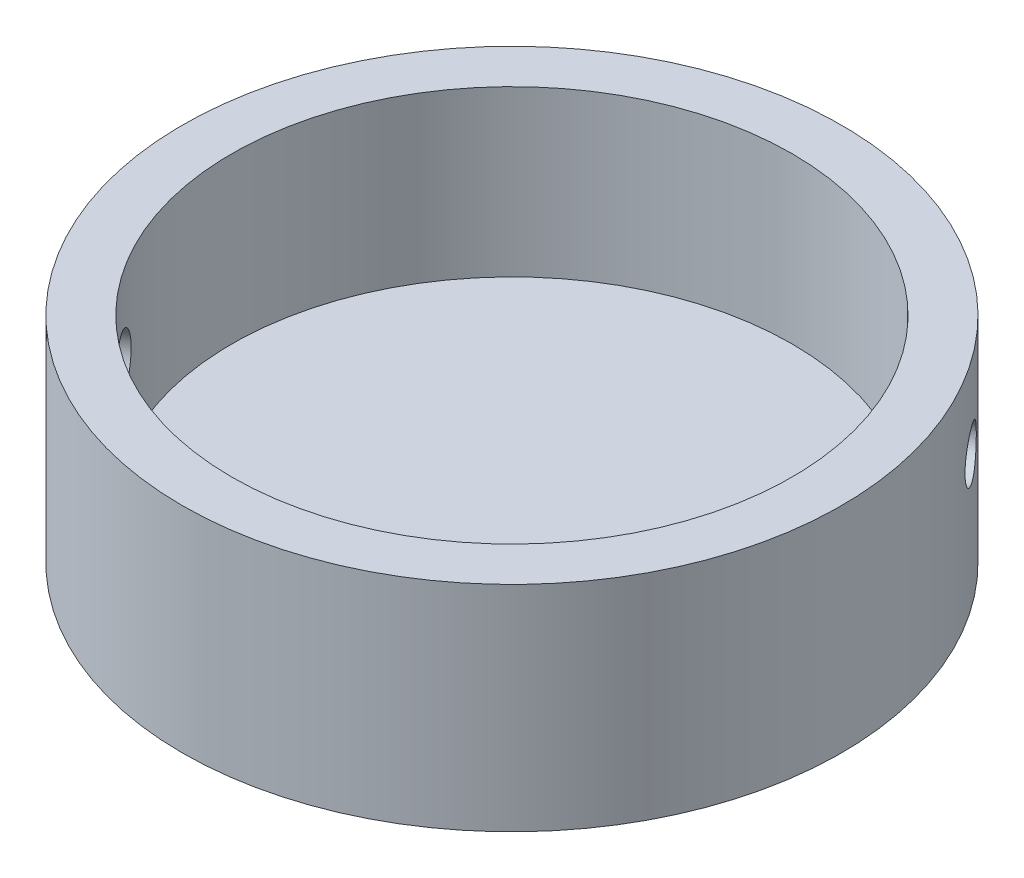
ISO-10303-21;
HEADER;
FILE_DESCRIPTION(('STEP AP214'),'2;1');
FILE_NAME('part.step','',(''),(''),'','','');
FILE_SCHEMA(('AUTOMOTIVE_DESIGN { 1 0 10303 214 1 1 1 1 }'));
ENDSEC;
DATA;
#1=APPLICATION_CONTEXT('core data for automotive mechanical design processes');
#2=APPLICATION_PROTOCOL_DEFINITION('international standard','automotive_design',2000,#1);
#3=PRODUCT_CONTEXT('',#1,'mechanical');
#4=PRODUCT('Part','Part','',(#3));
#5=PRODUCT_RELATED_PRODUCT_CATEGORY('part','',(#4));
#6=PRODUCT_DEFINITION_FORMATION('','',#4);
#7=PRODUCT_DEFINITION_CONTEXT('part definition',#1,'design');
#8=PRODUCT_DEFINITION('design','',#6,#7);
#9=PRODUCT_DEFINITION_SHAPE('','',#8);
#10=(LENGTH_UNIT() NAMED_UNIT(*) SI_UNIT(.MILLI.,.METRE.));
#11=(NAMED_UNIT(*) PLANE_ANGLE_UNIT() SI_UNIT($,.RADIAN.));
#12=(NAMED_UNIT(*) SI_UNIT($,.STERADIAN.) SOLID_ANGLE_UNIT());
#13=UNCERTAINTY_MEASURE_WITH_UNIT(LENGTH_MEASURE(1.E-05),#10,'distance_accuracy_value','');
#14=(GEOMETRIC_REPRESENTATION_CONTEXT(3) GLOBAL_UNCERTAINTY_ASSIGNED_CONTEXT((#13)) GLOBAL_UNIT_ASSIGNED_CONTEXT((#10,
#11,#12)) REPRESENTATION_CONTEXT('',''));
#15=CARTESIAN_POINT('',(0.,0.,0.));
#16=DIRECTION('',(0.,0.,1.));
#17=DIRECTION('',(1.,0.,0.));
#18=AXIS2_PLACEMENT_3D('',#15,#16,#17);
#19=CARTESIAN_POINT('',(0.,7.99999999999999,0.));
#20=DIRECTION('',(0.,-1.,0.));
#21=DIRECTION('',(0.,0.,-1.));
#22=AXIS2_PLACEMENT_3D('',#19,#20,#21);
#23=CYLINDRICAL_SURFACE('',#22,20.);
#24=CARTESIAN_POINT('',(17.0644188835617,7.99999999999999,-10.4309926740623));
#25=CARTESIAN_POINT('',(17.0644173383923,8.08412843427789,-10.4309961047137));
#26=CARTESIAN_POINT('',(17.0607078905008,8.16831485179459,-10.4370711444143));
#27=CARTESIAN_POINT('',(17.0459282208084,8.33436041564788,-10.4611913006159));
#28=CARTESIAN_POINT('',(17.0348495599132,8.41621678144795,-10.4792501407004));
#29=CARTESIAN_POINT('',(17.0055455498797,8.57517318343043,-10.5267371194599));
#30=CARTESIAN_POINT('',(16.9873241310381,8.65227580839915,-10.556159005497));
#31=CARTESIAN_POINT('',(16.9440949376596,8.7995725054576,-10.6254084527644));
#32=CARTESIAN_POINT('',(16.9190886586269,8.86976809534024,-10.6652337208319));
#33=CARTESIAN_POINT('',(16.8627399067336,9.00142502378373,-10.7541047087188));
#34=CARTESIAN_POINT('',(16.8313857143182,9.06286984389574,-10.803167470946));
#35=CARTESIAN_POINT('',(16.7630338766899,9.17513932464771,-10.9089252966577));
#36=CARTESIAN_POINT('',(16.7260359899343,9.22596353051863,-10.9656206867964));
#37=CARTESIAN_POINT('',(16.6471829029336,9.3156025520847,-11.084963448719));
#38=CARTESIAN_POINT('',(16.6053220898975,9.35440329709456,-11.1476176827794));
#39=CARTESIAN_POINT('',(16.5177847399715,9.41880396212044,-11.2769178517348));
#40=CARTESIAN_POINT('',(16.4721082585973,9.44440407415871,-11.3435637285498));
#41=CARTESIAN_POINT('',(16.3782020409041,9.48162983930447,-11.4787304870731));
#42=CARTESIAN_POINT('',(16.3299773150638,9.49328192297795,-11.5472475700493));
#43=CARTESIAN_POINT('',(16.2322093666743,9.50236254222416,-11.6842826960289));
#44=CARTESIAN_POINT('',(16.1826661644673,9.49979129711512,-11.7528007390011));
#45=CARTESIAN_POINT('',(16.0837868089909,9.48051993914591,-11.8877578950623));
#46=CARTESIAN_POINT('',(16.0344504397042,9.46384825115788,-11.9542009119524));
#47=CARTESIAN_POINT('',(15.9373660159192,9.41689341610155,-12.0833312519125));
#48=CARTESIAN_POINT('',(15.8896179740801,9.38661016057539,-12.146018545052));
#49=CARTESIAN_POINT('',(15.797156020124,9.31325991981666,-12.2660349093256));
#50=CARTESIAN_POINT('',(15.7524452003466,9.27018013860902,-12.3233585412199));
#51=CARTESIAN_POINT('',(15.6675583211121,9.17246901940773,-12.4311032528705));
#52=CARTESIAN_POINT('',(15.6273823358892,9.11783749235692,-12.4815242196347));
#53=CARTESIAN_POINT('',(15.5528168456133,8.99841332034257,-12.5743169968289));
#54=CARTESIAN_POINT('',(15.5184418314688,8.93359598808411,-12.6166686831287));
#55=CARTESIAN_POINT('',(15.4567889279755,8.79572636267122,-12.6921258240384));
#56=CARTESIAN_POINT('',(15.429511042994,8.72267406444935,-12.7252312729586));
#57=CARTESIAN_POINT('',(15.3830201472134,8.57039149562516,-12.7813937812065));
#58=CARTESIAN_POINT('',(15.3638078770393,8.49116065847027,-12.8044499177638));
#59=CARTESIAN_POINT('',(15.3341514129743,8.32877791939068,-12.8399509416727));
#60=CARTESIAN_POINT('',(15.3237070701451,8.24562608409614,-12.8523960092716));
#61=CARTESIAN_POINT('',(15.3119863497065,8.07797842309253,-12.866357628433));
#62=CARTESIAN_POINT('',(15.3106877158547,7.99348636190844,-12.8679007101975));
#63=CARTESIAN_POINT('',(15.3172475133819,7.8253662401495,-12.8600915085089));
#64=CARTESIAN_POINT('',(15.3251058757916,7.74173817307193,-12.8507393071179));
#65=CARTESIAN_POINT('',(15.3496752089435,7.57781842664373,-12.8213818637834));
#66=CARTESIAN_POINT('',(15.3663759132715,7.49752299428426,-12.8013889760843));
#67=CARTESIAN_POINT('',(15.4080170561139,7.3424317326262,-12.7512378433794));
#68=CARTESIAN_POINT('',(15.4329576020316,7.26763597502932,-12.72107946587));
#69=CARTESIAN_POINT('',(15.4902468534266,7.1255089474427,-12.6512563781895));
#70=CARTESIAN_POINT('',(15.5226097452444,7.05819234289802,-12.6115734568992));
#71=CARTESIAN_POINT('',(15.5935915420261,6.93308250175659,-12.5237009091231));
#72=CARTESIAN_POINT('',(15.632210534419,6.87528939827337,-12.4755111637538));
#73=CARTESIAN_POINT('',(15.7144824592902,6.77074974789214,-12.371718829589));
#74=CARTESIAN_POINT('',(15.7581453371984,6.72402559930597,-12.316101560477));
#75=CARTESIAN_POINT('',(15.8490056712914,6.64310368490611,-12.1989551420689));
#76=CARTESIAN_POINT('',(15.8962030979644,6.60890581451859,-12.1374260421322));
#77=CARTESIAN_POINT('',(15.9925811267392,6.554045891645,-12.0101502480073));
#78=CARTESIAN_POINT('',(16.0417596228471,6.53336984779076,-11.944407990888));
#79=CARTESIAN_POINT('',(16.1406416176612,6.50609474029986,-11.810445205782));
#80=CARTESIAN_POINT('',(16.1903451084935,6.49949546583584,-11.7422247149273));
#81=CARTESIAN_POINT('',(16.2887029292628,6.50056348721076,-11.6053969755487));
#82=CARTESIAN_POINT('',(16.3373595344109,6.50819581456374,-11.5367910868617));
#83=CARTESIAN_POINT('',(16.4324066404482,6.53743764383149,-11.4010035945233));
#84=CARTESIAN_POINT('',(16.4787971378177,6.55904716745487,-11.3338219930842));
#85=CARTESIAN_POINT('',(16.5681050496779,6.61562148054332,-11.2028648931852));
#86=CARTESIAN_POINT('',(16.61102257752,6.65058583391831,-11.139089283583));
#87=CARTESIAN_POINT('',(16.6923412210212,6.73287303275345,-11.0168570899139));
#88=CARTESIAN_POINT('',(16.7307424278199,6.78019562876177,-10.9584003985165));
#89=CARTESIAN_POINT('',(16.802238167585,6.88598681075831,-10.8484611924865));
#90=CARTESIAN_POINT('',(16.8353201309803,6.94448110311178,-10.796995240477));
#91=CARTESIAN_POINT('',(16.8953632989794,7.07091236452848,-10.7027953481066));
#92=CARTESIAN_POINT('',(16.9223230127681,7.13885162703556,-10.6600635348285));
#93=CARTESIAN_POINT('',(16.9695957056114,7.28235230828201,-10.5846498219784));
#94=CARTESIAN_POINT('',(16.9898980148269,7.35792571120347,-10.5519840602923));
#95=CARTESIAN_POINT('',(17.0233770056242,7.51440922893565,-10.4978882058155));
#96=CARTESIAN_POINT('',(17.0365619466321,7.59531303510229,-10.4764450904689));
#97=CARTESIAN_POINT('',(17.0521728393482,7.73058498515484,-10.4510060985272));
#98=CARTESIAN_POINT('',(17.0567607923755,7.78408113000137,-10.4435121586202));
#99=CARTESIAN_POINT('',(17.062884308621,7.89171017465653,-10.4335043473924));
#100=CARTESIAN_POINT('',(17.0644198782507,7.94584307312744,-10.4309904656112));
#101=CARTESIAN_POINT('',(17.0644188835617,7.99999999999999,-10.4309926740623));
#102=B_SPLINE_CURVE_WITH_KNOTS('',3,(#24,#25,#26,#27,#28,#29,#30,#31,#32,#33,#34,#35,#36,#37,
#38,#39,#40,#41,#42,#43,#44,#45,#46,#47,#48,#49,#50,#51,#52,#53,#54,#55,#56,#57,#58,#59,#60,#61,
#62,#63,#64,#65,#66,#67,#68,#69,#70,#71,#72,#73,#74,#75,#76,#77,#78,#79,#80,#81,#82,#83,#84,#85,
#86,#87,#88,#89,#90,#91,#92,#93,#94,#95,#96,#97,#98,#99,#100,#101),.UNSPECIFIED.,.T.,.F.,(4,2,2,
2,2,2,2,2,2,2,2,2,2,2,2,2,2,2,2,2,2,2,2,2,2,2,2,2,2,2,2,2,2,2,2,2,2,2,4),(0.,0.252187579339041,
0.504664457860794,0.757002605762187,1.00928517896143,1.26203783609002,1.5148013137358,
1.76785948521026,2.02091397548468,2.2734881817416,2.52605849341277,2.77812086259579,
3.03018524026398,3.28250252487075,3.53482393925043,3.7877666140638,4.04070944452772,
4.2936754963882,4.54663725110237,4.79898320559481,5.0513272594613,5.30337896930956,
5.55543396468601,5.80797478825659,6.06051914138528,6.31357024084872,6.5666192277034,
6.81940596249449,7.07218891127965,7.32435156508922,7.57651461054472,7.82866942254426,
8.08081914517806,8.33355621784139,8.58635476809665,8.83955652118654,9.09246380844972,
9.25480764733516,9.41715114522215),.UNSPECIFIED.);
#103=CARTESIAN_POINT('',(17.0644188835617,7.99999999999999,-10.4309926740623));
#104=VERTEX_POINT('',#103);
#105=EDGE_CURVE('E82',#104,#104,#102,.T.);
#106=ORIENTED_EDGE('',*,*,#105,.T.);
#107=EDGE_LOOP('',(#106));
#108=FACE_BOUND('',#107,.T.);
#109=CARTESIAN_POINT('',(-14.9845144139128,7.99999999999999,13.2462948698585));
#110=CARTESIAN_POINT('',(-14.9845183149582,7.88796087165279,13.2462916978549));
#111=CARTESIAN_POINT('',(-14.9908080350085,7.77584766317631,13.2391859125193));
#112=CARTESIAN_POINT('',(-15.0157398420939,7.55472962741292,13.2109007525868));
#113=CARTESIAN_POINT('',(-15.0343955419335,7.44572836392501,13.1897058682559));
#114=CARTESIAN_POINT('',(-15.0833200432092,7.23406836156418,13.1337287089828));
#115=CARTESIAN_POINT('',(-15.1135818041265,7.13140582121711,13.0989546712529));
#116=CARTESIAN_POINT('',(-15.1845554188817,6.93526441541649,13.0166131154718));
#117=CARTESIAN_POINT('',(-15.2252651971653,6.84178373103256,12.969048138319));
#118=CARTESIAN_POINT('',(-15.3157789498041,6.666297472685,12.8620304758411));
#119=CARTESIAN_POINT('',(-15.3656119046822,6.58432998099243,12.8025398488208));
#120=CARTESIAN_POINT('',(-15.4724976808217,6.43452478199286,12.6731543949427));
#121=CARTESIAN_POINT('',(-15.5295508322328,6.36668772118737,12.6032590922965));
#122=CARTESIAN_POINT('',(-15.6490292404276,6.24693748598569,12.4545968541747));
#123=CARTESIAN_POINT('',(-15.7114655116702,6.19505800241266,12.3758116221766));
#124=CARTESIAN_POINT('',(-15.8395204292836,6.10891113370263,12.2114876633666));
#125=CARTESIAN_POINT('',(-15.9051389980395,6.07464331926106,12.1259491012334));
#126=CARTESIAN_POINT('',(-16.0372375072753,6.0248041812935,11.950690684478));
#127=CARTESIAN_POINT('',(-16.1037138063949,6.0091703345001,11.8609858678585));
#128=CARTESIAN_POINT('',(-16.2357375720002,5.99684946173256,11.6796149006993));
#129=CARTESIAN_POINT('',(-16.3012850625245,6.00016194450745,11.5879488010742));
#130=CARTESIAN_POINT('',(-16.429369419746,6.0255889453003,11.4056211107144));
#131=CARTESIAN_POINT('',(-16.4919162079829,6.04763623112777,11.3149571009191));
#132=CARTESIAN_POINT('',(-16.6126291642053,6.10980225789323,11.1369710056473));
#133=CARTESIAN_POINT('',(-16.6707952752762,6.14992123357514,11.0496489635976));
#134=CARTESIAN_POINT('',(-16.7814687320953,6.24716552650887,10.8808328563149));
#135=CARTESIAN_POINT('',(-16.8339659575671,6.30432059506031,10.7993492985881));
#136=CARTESIAN_POINT('',(-16.9320582523819,6.43399304667273,10.644894895585));
#137=CARTESIAN_POINT('',(-16.9776531192264,6.50651088029036,10.5719243000727));
#138=CARTESIAN_POINT('',(-17.0612346973385,6.66522845902729,10.4365053523234));
#139=CARTESIAN_POINT('',(-17.0991872409993,6.75148668948315,10.3741044444437));
#140=CARTESIAN_POINT('',(-17.1665484006465,6.93503373042155,10.2622557227076));
#141=CARTESIAN_POINT('',(-17.1959570042394,7.03232255690428,10.2128079276404));
#142=CARTESIAN_POINT('',(-17.2457399443978,7.23521405039957,10.1285172824708));
#143=CARTESIAN_POINT('',(-17.2661123761087,7.34081846484577,10.0936775118724));
#144=CARTESIAN_POINT('',(-17.2974843975831,7.55732120922937,10.0398213913463));
#145=CARTESIAN_POINT('',(-17.3084842728973,7.66821937777488,10.0208045593464));
#146=CARTESIAN_POINT('',(-17.3209120094468,7.89164835905901,9.99930815506282));
#147=CARTESIAN_POINT('',(-17.3223810480221,8.00417004052966,9.99675744225545));
#148=CARTESIAN_POINT('',(-17.3158339434294,8.22810253164572,10.0080935251849));
#149=CARTESIAN_POINT('',(-17.3078179284252,8.33951335628073,10.0219800988179));
#150=CARTESIAN_POINT('',(-17.2824524770165,8.55782316455668,10.0656577242921));
#151=CARTESIAN_POINT('',(-17.2651227003489,8.66473114218931,10.0954152742466));
#152=CARTESIAN_POINT('',(-17.2214156037585,8.8712801034606,10.1697932323263));
#153=CARTESIAN_POINT('',(-17.1950380765881,8.97092092057436,10.2144139809069));
#154=CARTESIAN_POINT('',(-17.1335623122578,9.16047994805754,10.3172005511324));
#155=CARTESIAN_POINT('',(-17.0984346755864,9.2503638839325,10.3754119939598));
#156=CARTESIAN_POINT('',(-17.0201184413915,9.41751010654812,10.5033890542823));
#157=CARTESIAN_POINT('',(-16.9769296442737,9.49477208068014,10.573154957861));
#158=CARTESIAN_POINT('',(-16.8831402886953,9.63476326679618,10.722282678576));
#159=CARTESIAN_POINT('',(-16.8325135886334,9.69743911917243,10.8016781611508));
#160=CARTESIAN_POINT('',(-16.7250288629876,9.80611173701282,10.9673673992827));
#161=CARTESIAN_POINT('',(-16.6681709227994,9.8521087310142,11.0536610602998));
#162=CARTESIAN_POINT('',(-16.5496500188776,9.92602753531066,11.230332566447));
#163=CARTESIAN_POINT('',(-16.4879958444236,9.95398157465042,11.3207028190358));
#164=CARTESIAN_POINT('',(-16.3613649607151,9.99112613915968,11.502958033132));
#165=CARTESIAN_POINT('',(-16.2963883448914,10.0003171916681,11.594842951996));
#166=CARTESIAN_POINT('',(-16.1651997918085,9.99966746712011,11.7770481968377));
#167=CARTESIAN_POINT('',(-16.0989944787924,9.98990952632668,11.8673735990416));
#168=CARTESIAN_POINT('',(-15.9670227106613,9.95181250868604,12.0443503372663));
#169=CARTESIAN_POINT('',(-15.9012562558909,9.92347341725406,12.1310016704032));
#170=CARTESIAN_POINT('',(-15.7722176816676,9.84904148521413,12.2983054979207));
#171=CARTESIAN_POINT('',(-15.7089452232964,9.80295106613168,12.3789588087246));
#172=CARTESIAN_POINT('',(-15.5869443607007,9.69433366216603,12.5322293434281));
#173=CARTESIAN_POINT('',(-15.5282159298902,9.63180677345775,12.6048466143456));
#174=CARTESIAN_POINT('',(-15.4170568393163,9.49178076195249,12.7405690163148));
#175=CARTESIAN_POINT('',(-15.3646536150393,9.41421996751039,12.8036329916078));
#176=CARTESIAN_POINT('',(-15.2682789190856,9.2464492969091,12.918409002925));
#177=CARTESIAN_POINT('',(-15.2243094738978,9.15623638966184,12.9701183110535));
#178=CARTESIAN_POINT('',(-15.1463369673491,8.96547131616017,13.0610905510832));
#179=CARTESIAN_POINT('',(-15.1123595381581,8.86489343735189,13.1003214933223));
#180=CARTESIAN_POINT('',(-15.0558526377605,8.65650341750753,13.1652257915461));
#181=CARTESIAN_POINT('',(-15.0333102546479,8.54869959214856,13.1909144401318));
#182=CARTESIAN_POINT('',(-15.0061690088013,8.36690451820176,13.2217676624932));
#183=CARTESIAN_POINT('',(-14.9980629617503,8.29407549738714,13.2309551893796));
#184=CARTESIAN_POINT('',(-14.9872343913175,8.14750835391489,13.2432198245127));
#185=CARTESIAN_POINT('',(-14.9845118453367,8.07377023507481,13.2462969584096));
#186=CARTESIAN_POINT('',(-14.9845144139128,7.99999999999999,13.2462948698585));
#187=B_SPLINE_CURVE_WITH_KNOTS('',3,(#109,#110,#111,#112,#113,#114,#115,#116,#117,#118,#119,
#120,#121,#122,#123,#124,#125,#126,#127,#128,#129,#130,#131,#132,#133,#134,#135,#136,#137,#138,
#139,#140,#141,#142,#143,#144,#145,#146,#147,#148,#149,#150,#151,#152,#153,#154,#155,#156,#157,
#158,#159,#160,#161,#162,#163,#164,#165,#166,#167,#168,#169,#170,#171,#172,#173,#174,#175,#176,
#177,#178,#179,#180,#181,#182,#183,#184,#185,#186),.UNSPECIFIED.,.T.,.F.,(4,2,2,2,2,2,2,2,2,2,2,
2,2,2,2,2,2,2,2,2,2,2,2,2,2,2,2,2,2,2,2,2,2,2,2,2,2,2,4),(0.,0.335847988872924,
0.672066303643539,1.00808098199495,1.34402896084263,1.6810632305985,2.01811291710506,
2.35586939942583,2.69361764815589,3.03022941796899,3.36683245996464,3.70223263637323,
4.03763716961948,4.37363090932827,4.70963450437057,5.04710850170002,5.38458298855125,
5.72212858235867,6.05966389190066,6.3957399261553,6.7318114193374,7.06717629409054,
7.40254885122094,7.73906379623435,8.07558707446405,8.41332273636236,8.75105377036009,
9.08817985388722,9.42529646226298,9.76094266936965,10.0965891399332,10.4321898399049,
10.767788576216,11.1047943007598,11.4418809006905,11.7798248214095,12.11738629788,
12.3385205521209,12.5596538780763),.UNSPECIFIED.);
#188=CARTESIAN_POINT('',(-14.9845144139128,7.99999999999999,13.2462948698585));
#189=VERTEX_POINT('',#188);
#190=EDGE_CURVE('E72',#189,#189,#187,.T.);
#191=ORIENTED_EDGE('',*,*,#190,.T.);
#192=EDGE_LOOP('',(#191));
#193=FACE_BOUND('',#192,.T.);
#194=CARTESIAN_POINT('',(0.,0.,0.));
#195=DIRECTION('',(0.,1.,0.));
#196=DIRECTION('',(0.,0.,1.));
#197=AXIS2_PLACEMENT_3D('',#194,#195,#196);
#198=CIRCLE('',#197,20.);
#199=CARTESIAN_POINT('',(0.,0.,20.));
#200=VERTEX_POINT('',#199);
#201=EDGE_CURVE('E11',#200,#200,#198,.T.);
#202=ORIENTED_EDGE('',*,*,#201,.T.);
#203=EDGE_LOOP('',(#202));
#204=FACE_BOUND('',#203,.T.);
#205=CARTESIAN_POINT('',(0.,13.,0.));
#206=DIRECTION('',(0.,1.,0.));
#207=DIRECTION('',(0.,0.,1.));
#208=AXIS2_PLACEMENT_3D('',#205,#206,#207);
#209=CIRCLE('',#208,20.);
#210=CARTESIAN_POINT('',(0.,13.,20.));
#211=VERTEX_POINT('',#210);
#212=EDGE_CURVE('E66',#211,#211,#209,.T.);
#213=ORIENTED_EDGE('',*,*,#212,.F.);
#214=EDGE_LOOP('',(#213));
#215=FACE_BOUND('',#214,.T.);
#216=ADVANCED_FACE('F52',(#108,#193,#204,#215),#23,.T.);
#217=CARTESIAN_POINT('',(0.,0.,0.));
#218=DIRECTION('',(0.,1.,0.));
#219=DIRECTION('',(0.,0.,1.));
#220=AXIS2_PLACEMENT_3D('',#217,#218,#219);
#221=PLANE('',#220);
#222=ORIENTED_EDGE('',*,*,#201,.F.);
#223=EDGE_LOOP('',(#222));
#224=FACE_BOUND('',#223,.T.);
#225=ADVANCED_FACE('F117',(#224),#221,.F.);
#226=CARTESIAN_POINT('',(0.,13.,0.));
#227=DIRECTION('',(0.,1.,0.));
#228=DIRECTION('',(0.,0.,1.));
#229=AXIS2_PLACEMENT_3D('',#226,#227,#228);
#230=PLANE('',#229);
#231=CARTESIAN_POINT('',(0.,13.,0.));
#232=DIRECTION('',(0.,1.,0.));
#233=DIRECTION('',(0.,0.,1.));
#234=AXIS2_PLACEMENT_3D('',#231,#232,#233);
#235=CIRCLE('',#234,17.);
#236=CARTESIAN_POINT('',(0.,13.,17.));
#237=VERTEX_POINT('',#236);
#238=EDGE_CURVE('E102',#237,#237,#235,.T.);
#239=ORIENTED_EDGE('',*,*,#238,.F.);
#240=EDGE_LOOP('',(#239));
#241=FACE_BOUND('',#240,.T.);
#242=ORIENTED_EDGE('',*,*,#212,.T.);
#243=EDGE_LOOP('',(#242));
#244=FACE_BOUND('',#243,.T.);
#245=ADVANCED_FACE('F91',(#241,#244),#230,.T.);
#246=CARTESIAN_POINT('',(0.,7.99999999999999,0.));
#247=DIRECTION('',(-0.811701653998608,0.,0.584072277116389));
#248=DIRECTION('',(0.584072277116389,0.,0.811701653998608));
#249=AXIS2_PLACEMENT_3D('',#246,#247,#248);
#250=CYLINDRICAL_SURFACE('',#249,2.);
#251=CARTESIAN_POINT('',(-12.5349565146736,7.99999999999999,11.4836782075798));
#252=CARTESIAN_POINT('',(-12.5349605484548,7.88807699028084,11.4836752102923));
#253=CARTESIAN_POINT('',(-12.5413756191528,7.77608274141139,11.4766836026574));
#254=CARTESIAN_POINT('',(-12.5667910404063,7.5552073346403,11.4488472982893));
#255=CARTESIAN_POINT('',(-12.5858047697674,7.44632961461086,11.4279878749247));
#256=CARTESIAN_POINT('',(-12.6356271073104,7.23491737893529,11.3728755754074));
#257=CARTESIAN_POINT('',(-12.6664279812787,7.13237875498617,11.3386314813817));
#258=CARTESIAN_POINT('',(-12.7385929491791,6.93646091980448,11.2574945478664));
#259=CARTESIAN_POINT('',(-12.7799551450063,6.84308006688601,11.2106039811445));
#260=CARTESIAN_POINT('',(-12.8718671506637,6.66764392980859,11.104951420437));
#261=CARTESIAN_POINT('',(-12.9224569212874,6.58564074887654,11.0461376635339));
#262=CARTESIAN_POINT('',(-13.0308306268422,6.43573737563442,10.9180801794167));
#263=CARTESIAN_POINT('',(-13.0886149101538,6.367837866693,10.8488359470925));
#264=CARTESIAN_POINT('',(-13.2095035059974,6.24788419832918,10.7013141165542));
#265=CARTESIAN_POINT('',(-13.2726228680981,6.1958769116123,10.6230107178497));
#266=CARTESIAN_POINT('',(-13.4018741531276,6.10948408207352,10.4594751096807));
#267=CARTESIAN_POINT('',(-13.4680059763772,6.07509795664741,10.3742431294021));
#268=CARTESIAN_POINT('',(-13.6008153911844,6.02507844524873,10.199500090724));
#269=CARTESIAN_POINT('',(-13.6674890207903,6.00935869478212,10.1100107475918));
#270=CARTESIAN_POINT('',(-13.7996483024933,5.99685063809763,9.92886065935521));
#271=CARTESIAN_POINT('',(-13.8651339962039,6.00006166744092,9.8371999905731));
#272=CARTESIAN_POINT('',(-13.9927479006161,6.02525452685228,9.65480905101681));
#273=CARTESIAN_POINT('',(-14.0548911094291,6.04714347981763,9.56407642083448));
#274=CARTESIAN_POINT('',(-14.1745858359611,6.10892581018024,9.38576873397989));
#275=CARTESIAN_POINT('',(-14.2321372749002,6.14881949640217,9.29819373149641));
#276=CARTESIAN_POINT('',(-14.3414710020462,6.24557859473076,9.12865923229651));
#277=CARTESIAN_POINT('',(-14.3932391209614,6.30248448652431,9.04671370907258));
#278=CARTESIAN_POINT('',(-14.4898081041313,6.43162321944024,8.89122326816021));
#279=CARTESIAN_POINT('',(-14.534608685137,6.50385668338726,8.81767869202495));
#280=CARTESIAN_POINT('',(-14.6166983919132,6.66212099818552,8.68092971276296));
#281=CARTESIAN_POINT('',(-14.6539403914777,6.74823274683704,8.61779061828802));
#282=CARTESIAN_POINT('',(-14.7199777451307,6.93153052107696,8.50450284125851));
#283=CARTESIAN_POINT('',(-14.7487730778934,7.02871657462451,8.45435419150179));
#284=CARTESIAN_POINT('',(-14.7975088688425,7.23147283157848,8.36876154646199));
#285=CARTESIAN_POINT('',(-14.8174462306294,7.33704595159686,8.33332269343157));
#286=CARTESIAN_POINT('',(-14.8481787374483,7.55354435364596,8.27844106826959));
#287=CARTESIAN_POINT('',(-14.8589742712206,7.66446940788293,8.25899761596233));
#288=CARTESIAN_POINT('',(-14.8712455070937,7.88781298840373,8.23688162415515));
#289=CARTESIAN_POINT('',(-14.8727765357746,8.00021862312469,8.2341095258205));
#290=CARTESIAN_POINT('',(-14.8666468979689,8.22395508826699,8.24517121861238));
#291=CARTESIAN_POINT('',(-14.8589864045219,8.33528593888245,8.25900469712219));
#292=CARTESIAN_POINT('',(-14.8346095298461,8.55337649173113,8.3027089985423));
#293=CARTESIAN_POINT('',(-14.817920042846,8.66014875844665,8.33253219130728));
#294=CARTESIAN_POINT('',(-14.7757226879898,8.8664835395581,8.40713058710359));
#295=CARTESIAN_POINT('',(-14.750214544014,8.96604582808551,8.45190625830802));
#296=CARTESIAN_POINT('',(-14.6905936872722,9.15564747898597,8.5551161336648));
#297=CARTESIAN_POINT('',(-14.6564411837935,9.24563999339741,8.61361340569358));
#298=CARTESIAN_POINT('',(-14.5801101397528,9.41307046639469,8.74219446121053));
#299=CARTESIAN_POINT('',(-14.5379313232353,9.49050799315334,8.81227864306162));
#300=CARTESIAN_POINT('',(-14.4460315556078,9.63102541487611,8.96213824983722));
#301=CARTESIAN_POINT('',(-14.3962737400286,9.69403114299666,9.04196064182278));
#302=CARTESIAN_POINT('',(-14.2903422567601,9.80338417908978,9.20846572737275));
#303=CARTESIAN_POINT('',(-14.2341687056241,9.84973178962365,9.29514829630089));
#304=CARTESIAN_POINT('',(-14.1167932176613,9.92432946079809,9.47245565669498));
#305=CARTESIAN_POINT('',(-14.0556037630936,9.95262299411563,9.5630704130149));
#306=CARTESIAN_POINT('',(-13.9296047811324,9.99045093709068,9.74568673853083));
#307=CARTESIAN_POINT('',(-13.8647953975281,9.9999860913152,9.83768825253688));
#308=CARTESIAN_POINT('',(-13.7337424968768,10.0000137950706,10.0198218263434));
#309=CARTESIAN_POINT('',(-13.6675099985495,9.99062094750861,10.1099618186176));
#310=CARTESIAN_POINT('',(-13.5351942317367,9.95330123795792,10.2864320430458));
#311=CARTESIAN_POINT('',(-13.4691109632261,9.92537437908632,10.3727622758406));
#312=CARTESIAN_POINT('',(-13.3391938031508,9.8518140786363,10.5393106856928));
#313=CARTESIAN_POINT('',(-13.2753593032665,9.80618546634807,10.6195305226183));
#314=CARTESIAN_POINT('',(-13.1520322734493,9.6985287810485,10.7718923953776));
#315=CARTESIAN_POINT('',(-13.0925397710807,9.63650060393889,10.8440343799321));
#316=CARTESIAN_POINT('',(-12.9796233845741,9.4973793986083,10.9789422456671));
#317=CARTESIAN_POINT('',(-12.9262367335114,9.42020100922445,11.0416512675754));
#318=CARTESIAN_POINT('',(-12.8278679185551,9.25314569975164,11.1557831242393));
#319=CARTESIAN_POINT('',(-12.782887755667,9.16326576521847,11.2072032723996));
#320=CARTESIAN_POINT('',(-12.7029212313788,8.97300886806058,11.2977637438032));
#321=CARTESIAN_POINT('',(-12.6679696947643,8.87259694188929,11.3368613216214));
#322=CARTESIAN_POINT('',(-12.6096928049655,8.6644345225848,11.4016473940949));
#323=CARTESIAN_POINT('',(-12.5863546586099,8.55669225391708,11.4273506452608));
#324=CARTESIAN_POINT('',(-12.5579095410528,8.37364587970557,11.4585853232441));
#325=CARTESIAN_POINT('',(-12.5493185524737,8.29950168976691,11.4679848728423));
#326=CARTESIAN_POINT('',(-12.5378407035393,8.15024903214228,11.4805323010671));
#327=CARTESIAN_POINT('',(-12.5349538065564,8.07514057065129,11.4836802198371));
#328=CARTESIAN_POINT('',(-12.5349565146736,7.99999999999999,11.4836782075798));
#329=B_SPLINE_CURVE_WITH_KNOTS('',3,(#251,#252,#253,#254,#255,#256,#257,#258,#259,#260,#261,
#262,#263,#264,#265,#266,#267,#268,#269,#270,#271,#272,#273,#274,#275,#276,#277,#278,#279,#280,
#281,#282,#283,#284,#285,#286,#287,#288,#289,#290,#291,#292,#293,#294,#295,#296,#297,#298,#299,
#300,#301,#302,#303,#304,#305,#306,#307,#308,#309,#310,#311,#312,#313,#314,#315,#316,#317,#318,
#319,#320,#321,#322,#323,#324,#325,#326,#327,#328),.UNSPECIFIED.,.T.,.F.,(4,2,2,2,2,2,2,2,2,2,2,
2,2,2,2,2,2,2,2,2,2,2,2,2,2,2,2,2,2,2,2,2,2,2,2,2,2,2,4),(0.,0.335494561464556,
0.671345964526296,1.00697737325326,1.34254850394549,1.67960893073601,2.01668568538973,
2.35474723019431,2.69279759703001,3.02927772110039,3.36574603534953,3.70055092583552,
4.03536155925267,4.37097528591202,4.70660265260129,5.04426231883107,5.38192283756464,
5.71970129649408,6.05746539125823,6.39321039029386,6.72894906869087,7.06369316073763,
7.39844773485115,7.73477216244617,8.07110815542429,8.40913566772785,8.74715704012907,
9.08436138354594,9.42155234220829,9.75670785337425,10.0918633081722,10.4269273920195,
10.7619936027787,11.0990048712386,11.4360962569692,11.7743444177868,12.1122191390386,
12.3374580308376,12.5626954763111),.UNSPECIFIED.);
#330=CARTESIAN_POINT('',(-12.5349565146736,7.99999999999999,11.4836782075798));
#331=VERTEX_POINT('',#330);
#332=EDGE_CURVE('E95',#331,#331,#329,.T.);
#333=ORIENTED_EDGE('',*,*,#332,.T.);
#334=EDGE_LOOP('',(#333));
#335=FACE_BOUND('',#334,.T.);
#336=ORIENTED_EDGE('',*,*,#190,.F.);
#337=EDGE_LOOP('',(#336));
#338=FACE_BOUND('',#337,.T.);
#339=ADVANCED_FACE('F86',(#335,#338),#250,.F.);
#340=CARTESIAN_POINT('',(20.2925413416231,7.99999999999999,-14.601806939503));
#341=DIRECTION('',(-0.811701653664924,0.,0.584072277580119));
#342=DIRECTION('',(0.584072277580119,0.,0.811701653664924));
#343=AXIS2_PLACEMENT_3D('',#340,#341,#342);
#344=CYLINDRICAL_SURFACE('',#343,1.5);
#345=CARTESIAN_POINT('',(14.6212160189232,7.99999999999999,-8.67294887151909));
#346=CARTESIAN_POINT('',(14.6212145893855,8.08407951748676,-8.67295235787264));
#347=CARTESIAN_POINT('',(14.6175868728871,8.1682158221104,-8.67907608812667));
#348=CARTESIAN_POINT('',(14.6031266282602,8.33415917896378,-8.7033835345846));
#349=CARTESIAN_POINT('',(14.5922859980119,8.41596350384527,-8.72158081269527));
#350=CARTESIAN_POINT('',(14.5635903809573,8.57481554771252,-8.76941322936543));
#351=CARTESIAN_POINT('',(14.5457394465941,8.65186598505326,-8.79904175969338));
#352=CARTESIAN_POINT('',(14.5033449486961,8.79906858590893,-8.86874519282488));
#353=CARTESIAN_POINT('',(14.4788027879059,8.86922219108197,-8.90881790603917));
#354=CARTESIAN_POINT('',(14.4234087204497,9.0008583407996,-8.99822456061817));
#355=CARTESIAN_POINT('',(14.3925409472555,9.06231841100585,-9.04758176420137));
#356=CARTESIAN_POINT('',(14.3251434117306,9.17462965211388,-9.15391831307588));
#357=CARTESIAN_POINT('',(14.2886133989771,9.22548035356335,-9.21089799547007));
#358=CARTESIAN_POINT('',(14.2106066059002,9.31520511091138,-9.33079715631241));
#359=CARTESIAN_POINT('',(14.1691218853915,9.3540595751352,-9.3937261342624));
#360=CARTESIAN_POINT('',(14.0822164593715,9.4185636040289,-9.52351155339705));
#361=CARTESIAN_POINT('',(14.0367958302049,9.44421342476149,-9.59036791839431));
#362=CARTESIAN_POINT('',(13.9432860048511,9.48151496792064,-9.72581753755796));
#363=CARTESIAN_POINT('',(13.8952041223098,9.4932032380142,-9.79440577481008));
#364=CARTESIAN_POINT('',(13.7975645271361,9.50236290289381,-9.93147987142536));
#365=CARTESIAN_POINT('',(13.7480068449525,9.49983459079568,-9.99996573287017));
#366=CARTESIAN_POINT('',(13.648984625459,9.48066268837457,-10.1347023401518));
#367=CARTESIAN_POINT('',(13.5995202127345,9.46405839882204,-10.2009587756723));
#368=CARTESIAN_POINT('',(13.5020446170702,9.41726701763367,-10.3296326375537));
#369=CARTESIAN_POINT('',(13.4540334493743,9.38707978357089,-10.3920500236516));
#370=CARTESIAN_POINT('',(13.3609212040489,9.31393581221962,-10.5114952967954));
#371=CARTESIAN_POINT('',(13.3158242286964,9.27096153168613,-10.5685156367507));
#372=CARTESIAN_POINT('',(13.230099774302,9.17347608693091,-10.6756345893833));
#373=CARTESIAN_POINT('',(13.1894723970963,9.11896465992722,-10.7257330443576));
#374=CARTESIAN_POINT('',(13.1139472287114,8.99973092961788,-10.8179462163067));
#375=CARTESIAN_POINT('',(13.0790694327451,8.93497446581452,-10.8600331471065));
#376=CARTESIAN_POINT('',(13.0164535478444,8.797207739996,-10.9350048289145));
#377=CARTESIAN_POINT('',(12.9887154658839,8.72419746991877,-10.967889570934));
#378=CARTESIAN_POINT('',(12.9413943456982,8.57197096360588,-11.0236862061973));
#379=CARTESIAN_POINT('',(12.9218124932426,8.4927538269907,-11.0465966493788));
#380=CARTESIAN_POINT('',(12.891549716156,8.33037415983165,-11.0818992655606));
#381=CARTESIAN_POINT('',(12.88086858138,8.24721172248497,-11.0942916868906));
#382=CARTESIAN_POINT('',(12.8688378957723,8.07960195034906,-11.1082445720605));
#383=CARTESIAN_POINT('',(12.8674570400118,7.99515988590615,-11.1098413742438));
#384=CARTESIAN_POINT('',(12.8739969484497,7.82712451987584,-11.1022622310561));
#385=CARTESIAN_POINT('',(12.8819176152101,7.74353120940658,-11.0930863985338));
#386=CARTESIAN_POINT('',(12.9067361490752,7.57970400631161,-11.0641999208707));
#387=CARTESIAN_POINT('',(12.9236194521861,7.49946489076246,-11.0445063663743));
#388=CARTESIAN_POINT('',(12.9657188345426,7.34446182811553,-10.9950526828482));
#389=CARTESIAN_POINT('',(12.9909350633576,7.26969797932385,-10.9652923731281));
#390=CARTESIAN_POINT('',(13.0488520319532,7.12754931253011,-10.8963061046693));
#391=CARTESIAN_POINT('',(13.0815725022511,7.06018465189516,-10.8570551777014));
#392=CARTESIAN_POINT('',(13.153289866218,6.93495051183052,-10.7700573552361));
#393=CARTESIAN_POINT('',(13.1922868808771,6.87708121548203,-10.7223102959607));
#394=CARTESIAN_POINT('',(13.275323562237,6.7723169478616,-10.619329693007));
#395=CARTESIAN_POINT('',(13.3193769986578,6.72545305543254,-10.5640756273042));
#396=CARTESIAN_POINT('',(13.4109563156165,6.64424330276273,-10.4475706887356));
#397=CARTESIAN_POINT('',(13.4584821578542,6.60989730447655,-10.3863198820103));
#398=CARTESIAN_POINT('',(13.5553979206361,6.55475147468107,-10.2595097969516));
#399=CARTESIAN_POINT('',(13.6047851089391,6.53393254806546,-10.1939567364267));
#400=CARTESIAN_POINT('',(13.7039561963344,6.50636944945459,-10.0602440209995));
#401=CARTESIAN_POINT('',(13.753740086894,6.49962497554838,-9.99208442204185));
#402=CARTESIAN_POINT('',(13.8520716476506,6.50040594925865,-9.85531234818684));
#403=CARTESIAN_POINT('',(13.9006229418738,6.50788301447439,-9.78670219729797));
#404=CARTESIAN_POINT('',(13.9953301487421,6.53679377127562,-9.65078223784595));
#405=CARTESIAN_POINT('',(14.0414860584714,6.55822747984972,-9.58347243086574));
#406=CARTESIAN_POINT('',(14.1302192706775,6.61443048339422,-9.4521525614162));
#407=CARTESIAN_POINT('',(14.1727968482839,6.64919875195607,-9.3881422454034));
#408=CARTESIAN_POINT('',(14.2533735627607,6.73107852655317,-9.26535168376378));
#409=CARTESIAN_POINT('',(14.2913727593677,6.77818987151639,-9.20657136990102));
#410=CARTESIAN_POINT('',(14.3620845331129,6.88360017200874,-9.09587068806778));
#411=CARTESIAN_POINT('',(14.3947795117834,6.94193502031015,-9.04397325618912));
#412=CARTESIAN_POINT('',(14.4540788745081,7.06806943921269,-8.94889671535008));
#413=CARTESIAN_POINT('',(14.4806817855236,7.13587129253325,-8.90571971525395));
#414=CARTESIAN_POINT('',(14.5273301461768,7.27916213644494,-8.82942177857217));
#415=CARTESIAN_POINT('',(14.5473620096568,7.35466663580705,-8.79632168681725));
#416=CARTESIAN_POINT('',(14.5804127589196,7.51105626991092,-8.74143008094092));
#417=CARTESIAN_POINT('',(14.5934396660086,7.59193513072025,-8.71962563334156));
#418=CARTESIAN_POINT('',(14.6089652945392,7.7277383226165,-8.69357614645882));
#419=CARTESIAN_POINT('',(14.6135552716487,7.7817906010854,-8.68585279750106));
#420=CARTESIAN_POINT('',(14.6196810944437,7.89055389910809,-8.67553803314429));
#421=CARTESIAN_POINT('',(14.6212169495406,7.94526491663143,-8.67294660193123));
#422=CARTESIAN_POINT('',(14.6212160189232,7.99999999999999,-8.67294887151909));
#423=B_SPLINE_CURVE_WITH_KNOTS('',3,(#345,#346,#347,#348,#349,#350,#351,#352,#353,#354,#355,
#356,#357,#358,#359,#360,#361,#362,#363,#364,#365,#366,#367,#368,#369,#370,#371,#372,#373,#374,
#375,#376,#377,#378,#379,#380,#381,#382,#383,#384,#385,#386,#387,#388,#389,#390,#391,#392,#393,
#394,#395,#396,#397,#398,#399,#400,#401,#402,#403,#404,#405,#406,#407,#408,#409,#410,#411,#412,
#413,#414,#415,#416,#417,#418,#419,#420,#421,#422),.UNSPECIFIED.,.T.,.F.,(4,2,2,2,2,2,2,2,2,2,2,
2,2,2,2,2,2,2,2,2,2,2,2,2,2,2,2,2,2,2,2,2,2,2,2,2,2,2,4),(0.,0.252038695018247,
0.504360979031313,0.756537617428056,1.00866143027265,1.26142556055625,1.51420087298959,
1.76738684845994,2.02056791399618,2.27308475540121,2.52559639046296,2.77740531479011,
3.02921687957624,3.28137552389821,3.53353991226424,3.78656354750223,4.03958742988798,
4.2926480845817,4.54570276436764,4.79790522937579,5.050105052462,5.30189630784819,
5.55369208293145,5.80615763950679,6.0586280633269,6.31180310345512,6.56497535152301,
6.81778943524099,7.07059809579089,7.32254822648262,7.57449866385935,7.82642971160525,
8.07835747191913,8.33110470711196,8.58391299124038,8.83724072926353,9.09027776311013,
9.25435341324418,9.41842855777743),.UNSPECIFIED.);
#424=CARTESIAN_POINT('',(14.6212160189232,7.99999999999999,-8.67294887151909));
#425=VERTEX_POINT('',#424);
#426=EDGE_CURVE('E56',#425,#425,#423,.T.);
#427=ORIENTED_EDGE('',*,*,#426,.T.);
#428=EDGE_LOOP('',(#427));
#429=FACE_BOUND('',#428,.T.);
#430=ORIENTED_EDGE('',*,*,#105,.F.);
#431=EDGE_LOOP('',(#430));
#432=FACE_BOUND('',#431,.T.);
#433=ADVANCED_FACE('F90',(#429,#432),#344,.F.);
#434=CARTESIAN_POINT('',(0.,2.99999999999999,0.));
#435=DIRECTION('',(0.,1.,0.));
#436=DIRECTION('',(0.,0.,1.));
#437=AXIS2_PLACEMENT_3D('',#434,#435,#436);
#438=CYLINDRICAL_SURFACE('',#437,17.);
#439=ORIENTED_EDGE('',*,*,#426,.F.);
#440=EDGE_LOOP('',(#439));
#441=FACE_BOUND('',#440,.T.);
#442=CARTESIAN_POINT('',(0.,2.99999999999999,0.));
#443=DIRECTION('',(0.,1.,0.));
#444=DIRECTION('',(0.,0.,1.));
#445=AXIS2_PLACEMENT_3D('',#442,#443,#444);
#446=CIRCLE('',#445,17.);
#447=CARTESIAN_POINT('',(0.,2.99999999999999,17.));
#448=VERTEX_POINT('',#447);
#449=EDGE_CURVE('E138',#448,#448,#446,.T.);
#450=ORIENTED_EDGE('',*,*,#449,.F.);
#451=EDGE_LOOP('',(#450));
#452=FACE_BOUND('',#451,.T.);
#453=ORIENTED_EDGE('',*,*,#238,.T.);
#454=EDGE_LOOP('',(#453));
#455=FACE_BOUND('',#454,.T.);
#456=ORIENTED_EDGE('',*,*,#332,.F.);
#457=EDGE_LOOP('',(#456));
#458=FACE_BOUND('',#457,.T.);
#459=ADVANCED_FACE('F104',(#441,#452,#455,#458),#438,.F.);
#460=CARTESIAN_POINT('',(0.,2.99999999999999,0.));
#461=DIRECTION('',(0.,1.,0.));
#462=DIRECTION('',(0.,0.,1.));
#463=AXIS2_PLACEMENT_3D('',#460,#461,#462);
#464=PLANE('',#463);
#465=ORIENTED_EDGE('',*,*,#449,.T.);
#466=EDGE_LOOP('',(#465));
#467=FACE_BOUND('',#466,.T.);
#468=ADVANCED_FACE('F108',(#467),#464,.T.);
#469=CLOSED_SHELL('',(#216,#225,#245,#339,#433,#459,#468));
#470=MANIFOLD_SOLID_BREP('B2',#469);
#471=ADVANCED_BREP_SHAPE_REPRESENTATION('',(#18,#470),#14);
#472=SHAPE_DEFINITION_REPRESENTATION(#9,#471);
ENDSEC;
END-ISO-10303-21;
